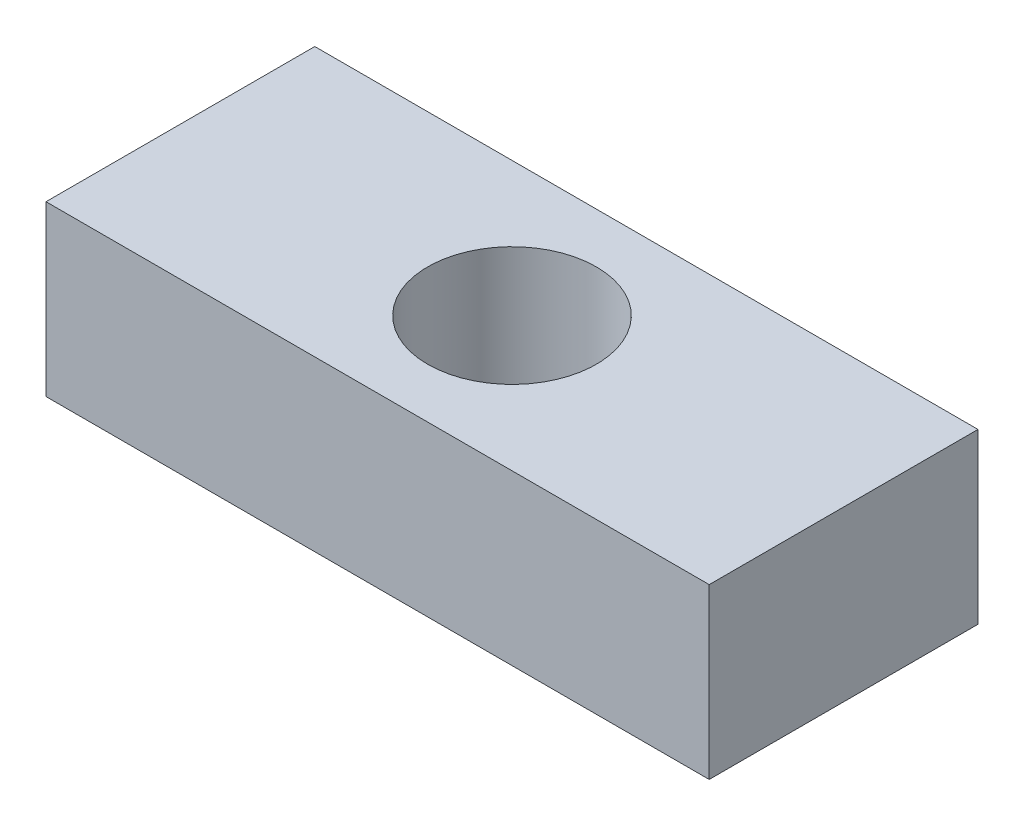
ISO-10303-21;
HEADER;
FILE_DESCRIPTION(('STEP AP214'),'2;1');
FILE_NAME('part.step','',(''),(''),'','','');
FILE_SCHEMA(('AUTOMOTIVE_DESIGN { 1 0 10303 214 1 1 1 1 }'));
ENDSEC;
DATA;
#1=APPLICATION_CONTEXT('core data for automotive mechanical design processes');
#2=APPLICATION_PROTOCOL_DEFINITION('international standard','automotive_design',2000,#1);
#3=PRODUCT_CONTEXT('',#1,'mechanical');
#4=PRODUCT('Part','Part','',(#3));
#5=PRODUCT_RELATED_PRODUCT_CATEGORY('part','',(#4));
#6=PRODUCT_DEFINITION_FORMATION('','',#4);
#7=PRODUCT_DEFINITION_CONTEXT('part definition',#1,'design');
#8=PRODUCT_DEFINITION('design','',#6,#7);
#9=PRODUCT_DEFINITION_SHAPE('','',#8);
#10=(LENGTH_UNIT() NAMED_UNIT(*) SI_UNIT(.MILLI.,.METRE.));
#11=(NAMED_UNIT(*) PLANE_ANGLE_UNIT() SI_UNIT($,.RADIAN.));
#12=(NAMED_UNIT(*) SI_UNIT($,.STERADIAN.) SOLID_ANGLE_UNIT());
#13=UNCERTAINTY_MEASURE_WITH_UNIT(LENGTH_MEASURE(1.E-05),#10,'distance_accuracy_value','');
#14=(GEOMETRIC_REPRESENTATION_CONTEXT(3) GLOBAL_UNCERTAINTY_ASSIGNED_CONTEXT((#13)) GLOBAL_UNIT_ASSIGNED_CONTEXT((#10,
#11,#12)) REPRESENTATION_CONTEXT('',''));
#15=CARTESIAN_POINT('',(0.,0.,0.));
#16=DIRECTION('',(0.,0.,1.));
#17=DIRECTION('',(1.,0.,0.));
#18=AXIS2_PLACEMENT_3D('',#15,#16,#17);
#19=CARTESIAN_POINT('',(0.,2.413,0.));
#20=DIRECTION('',(0.,1.,0.));
#21=DIRECTION('',(0.,0.,1.));
#22=AXIS2_PLACEMENT_3D('',#19,#20,#21);
#23=PLANE('',#22);
#24=DIRECTION('',(0.,0.,1.));
#25=VECTOR('',#24,1.);
#26=CARTESIAN_POINT('',(-4.7413509124037,2.413,1.92163386561208));
#27=LINE('',#26,#25);
#28=CARTESIAN_POINT('',(-4.7413509124037,2.413,-1.92163386561208));
#29=VERTEX_POINT('',#28);
#30=CARTESIAN_POINT('',(-4.7413509124037,2.413,1.92163386561208));
#31=VERTEX_POINT('',#30);
#32=EDGE_CURVE('E92',#29,#31,#27,.T.);
#33=ORIENTED_EDGE('',*,*,#32,.T.);
#34=DIRECTION('',(1.,0.,0.));
#35=VECTOR('',#34,1.);
#36=CARTESIAN_POINT('',(4.7413509124037,2.413,1.92163386561208));
#37=LINE('',#36,#35);
#38=CARTESIAN_POINT('',(4.7413509124037,2.413,1.92163386561208));
#39=VERTEX_POINT('',#38);
#40=EDGE_CURVE('E87',#31,#39,#37,.T.);
#41=ORIENTED_EDGE('',*,*,#40,.T.);
#42=DIRECTION('',(0.,0.,-1.));
#43=VECTOR('',#42,1.);
#44=CARTESIAN_POINT('',(4.7413509124037,2.413,1.92163386561208));
#45=LINE('',#44,#43);
#46=CARTESIAN_POINT('',(4.7413509124037,2.413,-1.92163386561208));
#47=VERTEX_POINT('',#46);
#48=EDGE_CURVE('E90',#39,#47,#45,.T.);
#49=ORIENTED_EDGE('',*,*,#48,.T.);
#50=DIRECTION('',(-1.,0.,0.));
#51=VECTOR('',#50,1.);
#52=CARTESIAN_POINT('',(4.7413509124037,2.413,-1.92163386561208));
#53=LINE('',#52,#51);
#54=EDGE_CURVE('E57',#47,#29,#53,.T.);
#55=ORIENTED_EDGE('',*,*,#54,.T.);
#56=EDGE_LOOP('',(#33,#41,#49,#55));
#57=FACE_BOUND('',#56,.T.);
#58=CARTESIAN_POINT('',(0.,2.413,0.));
#59=DIRECTION('',(0.,1.,0.));
#60=DIRECTION('',(0.,0.,1.));
#61=AXIS2_PLACEMENT_3D('',#58,#59,#60);
#62=CIRCLE('',#61,1.2065);
#63=CARTESIAN_POINT('',(0.,2.413,1.2065));
#64=VERTEX_POINT('',#63);
#65=EDGE_CURVE('E112',#64,#64,#62,.T.);
#66=ORIENTED_EDGE('',*,*,#65,.F.);
#67=EDGE_LOOP('',(#66));
#68=FACE_BOUND('',#67,.T.);
#69=ADVANCED_FACE('F39',(#57,#68),#23,.T.);
#70=CARTESIAN_POINT('',(0.,0.,0.));
#71=DIRECTION('',(0.,1.,0.));
#72=DIRECTION('',(0.,0.,1.));
#73=AXIS2_PLACEMENT_3D('',#70,#71,#72);
#74=PLANE('',#73);
#75=DIRECTION('',(0.,0.,1.));
#76=VECTOR('',#75,1.);
#77=CARTESIAN_POINT('',(-4.7413509124037,0.,1.92163386561208));
#78=LINE('',#77,#76);
#79=CARTESIAN_POINT('',(-4.7413509124037,0.,-1.92163386561208));
#80=VERTEX_POINT('',#79);
#81=CARTESIAN_POINT('',(-4.7413509124037,0.,1.92163386561208));
#82=VERTEX_POINT('',#81);
#83=EDGE_CURVE('E108',#80,#82,#78,.T.);
#84=ORIENTED_EDGE('',*,*,#83,.F.);
#85=DIRECTION('',(-1.,0.,0.));
#86=VECTOR('',#85,1.);
#87=CARTESIAN_POINT('',(4.7413509124037,0.,-1.92163386561208));
#88=LINE('',#87,#86);
#89=CARTESIAN_POINT('',(4.7413509124037,0.,-1.92163386561208));
#90=VERTEX_POINT('',#89);
#91=EDGE_CURVE('E80',#90,#80,#88,.T.);
#92=ORIENTED_EDGE('',*,*,#91,.F.);
#93=DIRECTION('',(0.,0.,-1.));
#94=VECTOR('',#93,1.);
#95=CARTESIAN_POINT('',(4.7413509124037,0.,1.92163386561208));
#96=LINE('',#95,#94);
#97=CARTESIAN_POINT('',(4.7413509124037,0.,1.92163386561208));
#98=VERTEX_POINT('',#97);
#99=EDGE_CURVE('E74',#98,#90,#96,.T.);
#100=ORIENTED_EDGE('',*,*,#99,.F.);
#101=DIRECTION('',(1.,0.,0.));
#102=VECTOR('',#101,1.);
#103=CARTESIAN_POINT('',(4.7413509124037,0.,1.92163386561208));
#104=LINE('',#103,#102);
#105=EDGE_CURVE('E97',#82,#98,#104,.T.);
#106=ORIENTED_EDGE('',*,*,#105,.F.);
#107=EDGE_LOOP('',(#84,#92,#100,#106));
#108=FACE_BOUND('',#107,.T.);
#109=CARTESIAN_POINT('',(0.,0.,0.));
#110=DIRECTION('',(0.,1.,0.));
#111=DIRECTION('',(0.,0.,1.));
#112=AXIS2_PLACEMENT_3D('',#109,#110,#111);
#113=CIRCLE('',#112,1.2065);
#114=CARTESIAN_POINT('',(0.,0.,1.2065));
#115=VERTEX_POINT('',#114);
#116=EDGE_CURVE('E130',#115,#115,#113,.T.);
#117=ORIENTED_EDGE('',*,*,#116,.T.);
#118=EDGE_LOOP('',(#117));
#119=FACE_BOUND('',#118,.T.);
#120=ADVANCED_FACE('F125',(#108,#119),#74,.F.);
#121=CARTESIAN_POINT('',(-4.7413509124037,2.413,1.92163386561208));
#122=DIRECTION('',(1.,0.,0.));
#123=DIRECTION('',(0.,0.,-1.));
#124=AXIS2_PLACEMENT_3D('',#121,#122,#123);
#125=PLANE('',#124);
#126=ORIENTED_EDGE('',*,*,#83,.T.);
#127=DIRECTION('',(0.,-1.,0.));
#128=VECTOR('',#127,1.);
#129=CARTESIAN_POINT('',(-4.7413509124037,2.413,1.92163386561208));
#130=LINE('',#129,#128);
#131=EDGE_CURVE('E11',#31,#82,#130,.T.);
#132=ORIENTED_EDGE('',*,*,#131,.F.);
#133=ORIENTED_EDGE('',*,*,#32,.F.);
#134=DIRECTION('',(0.,-1.,0.));
#135=VECTOR('',#134,1.);
#136=CARTESIAN_POINT('',(-4.7413509124037,2.413,-1.92163386561208));
#137=LINE('',#136,#135);
#138=EDGE_CURVE('E104',#29,#80,#137,.T.);
#139=ORIENTED_EDGE('',*,*,#138,.T.);
#140=EDGE_LOOP('',(#126,#132,#133,#139));
#141=FACE_BOUND('',#140,.T.);
#142=ADVANCED_FACE('F41',(#141),#125,.F.);
#143=CARTESIAN_POINT('',(4.7413509124037,2.413,1.92163386561208));
#144=DIRECTION('',(0.,0.,-1.));
#145=DIRECTION('',(-1.,0.,0.));
#146=AXIS2_PLACEMENT_3D('',#143,#144,#145);
#147=PLANE('',#146);
#148=ORIENTED_EDGE('',*,*,#105,.T.);
#149=DIRECTION('',(0.,-1.,0.));
#150=VECTOR('',#149,1.);
#151=CARTESIAN_POINT('',(4.7413509124037,2.413,1.92163386561208));
#152=LINE('',#151,#150);
#153=EDGE_CURVE('E49',#39,#98,#152,.T.);
#154=ORIENTED_EDGE('',*,*,#153,.F.);
#155=ORIENTED_EDGE('',*,*,#40,.F.);
#156=ORIENTED_EDGE('',*,*,#131,.T.);
#157=EDGE_LOOP('',(#148,#154,#155,#156));
#158=FACE_BOUND('',#157,.T.);
#159=ADVANCED_FACE('F96',(#158),#147,.F.);
#160=CARTESIAN_POINT('',(4.7413509124037,2.413,1.92163386561208));
#161=DIRECTION('',(-1.,0.,0.));
#162=DIRECTION('',(0.,0.,1.));
#163=AXIS2_PLACEMENT_3D('',#160,#161,#162);
#164=PLANE('',#163);
#165=ORIENTED_EDGE('',*,*,#99,.T.);
#166=DIRECTION('',(0.,-1.,0.));
#167=VECTOR('',#166,1.);
#168=CARTESIAN_POINT('',(4.7413509124037,2.413,-1.92163386561208));
#169=LINE('',#168,#167);
#170=EDGE_CURVE('E99',#47,#90,#169,.T.);
#171=ORIENTED_EDGE('',*,*,#170,.F.);
#172=ORIENTED_EDGE('',*,*,#48,.F.);
#173=ORIENTED_EDGE('',*,*,#153,.T.);
#174=EDGE_LOOP('',(#165,#171,#172,#173));
#175=FACE_BOUND('',#174,.T.);
#176=ADVANCED_FACE('F100',(#175),#164,.F.);
#177=CARTESIAN_POINT('',(4.7413509124037,2.413,-1.92163386561208));
#178=DIRECTION('',(0.,0.,1.));
#179=DIRECTION('',(1.,0.,0.));
#180=AXIS2_PLACEMENT_3D('',#177,#178,#179);
#181=PLANE('',#180);
#182=ORIENTED_EDGE('',*,*,#91,.T.);
#183=ORIENTED_EDGE('',*,*,#138,.F.);
#184=ORIENTED_EDGE('',*,*,#54,.F.);
#185=ORIENTED_EDGE('',*,*,#170,.T.);
#186=EDGE_LOOP('',(#182,#183,#184,#185));
#187=FACE_BOUND('',#186,.T.);
#188=ADVANCED_FACE('F122',(#187),#181,.F.);
#189=CARTESIAN_POINT('',(0.,2.413,0.));
#190=DIRECTION('',(0.,-1.,0.));
#191=DIRECTION('',(0.,0.,-1.));
#192=AXIS2_PLACEMENT_3D('',#189,#190,#191);
#193=CYLINDRICAL_SURFACE('',#192,1.2065);
#194=ORIENTED_EDGE('',*,*,#65,.T.);
#195=EDGE_LOOP('',(#194));
#196=FACE_BOUND('',#195,.T.);
#197=ORIENTED_EDGE('',*,*,#116,.F.);
#198=EDGE_LOOP('',(#197));
#199=FACE_BOUND('',#198,.T.);
#200=ADVANCED_FACE('F138',(#196,#199),#193,.F.);
#201=CLOSED_SHELL('',(#69,#120,#142,#159,#176,#188,#200));
#202=MANIFOLD_SOLID_BREP('B2',#201);
#203=ADVANCED_BREP_SHAPE_REPRESENTATION('',(#18,#202),#14);
#204=SHAPE_DEFINITION_REPRESENTATION(#9,#203);
ENDSEC;
END-ISO-10303-21;
